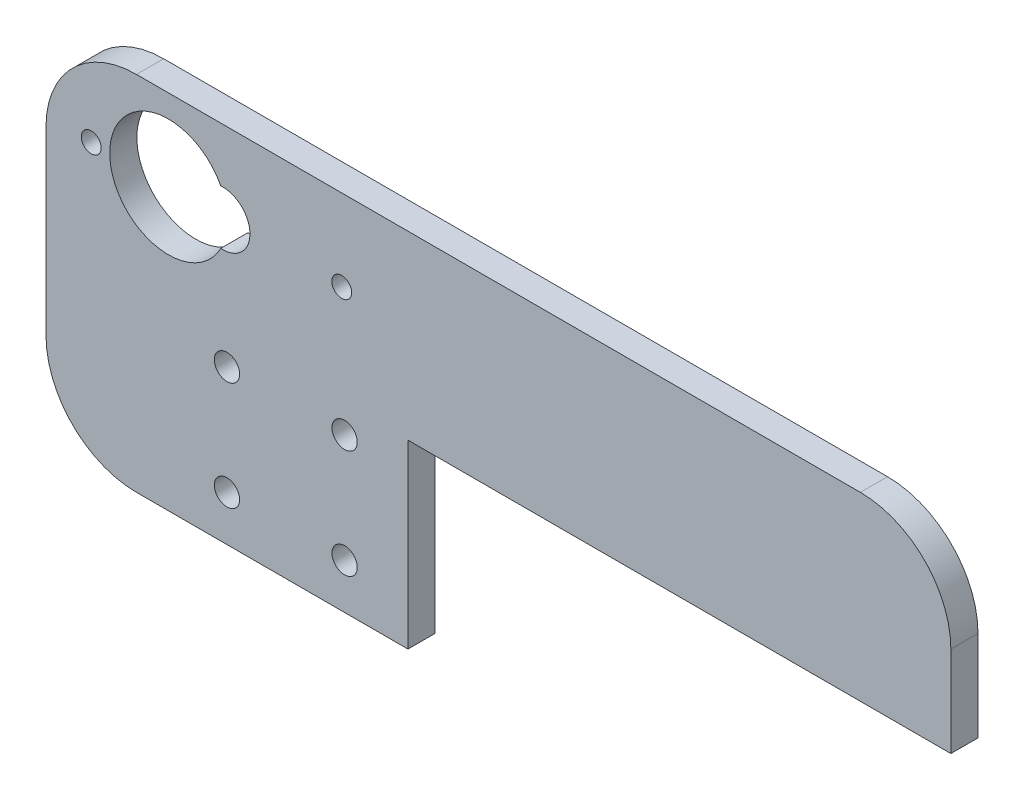
ISO-10303-21;
HEADER;
FILE_DESCRIPTION(('STEP AP214'),'2;1');
FILE_NAME('part.step','',(''),(''),'','','');
FILE_SCHEMA(('AUTOMOTIVE_DESIGN { 1 0 10303 214 1 1 1 1 }'));
ENDSEC;
DATA;
#1=APPLICATION_CONTEXT('core data for automotive mechanical design processes');
#2=APPLICATION_PROTOCOL_DEFINITION('international standard','automotive_design',2000,#1);
#3=PRODUCT_CONTEXT('',#1,'mechanical');
#4=PRODUCT('Part','Part','',(#3));
#5=PRODUCT_RELATED_PRODUCT_CATEGORY('part','',(#4));
#6=PRODUCT_DEFINITION_FORMATION('','',#4);
#7=PRODUCT_DEFINITION_CONTEXT('part definition',#1,'design');
#8=PRODUCT_DEFINITION('design','',#6,#7);
#9=PRODUCT_DEFINITION_SHAPE('','',#8);
#10=(LENGTH_UNIT() NAMED_UNIT(*) SI_UNIT(.MILLI.,.METRE.));
#11=(NAMED_UNIT(*) PLANE_ANGLE_UNIT() SI_UNIT($,.RADIAN.));
#12=(NAMED_UNIT(*) SI_UNIT($,.STERADIAN.) SOLID_ANGLE_UNIT());
#13=UNCERTAINTY_MEASURE_WITH_UNIT(LENGTH_MEASURE(1.E-05),#10,'distance_accuracy_value','');
#14=(GEOMETRIC_REPRESENTATION_CONTEXT(3) GLOBAL_UNCERTAINTY_ASSIGNED_CONTEXT((#13)) GLOBAL_UNIT_ASSIGNED_CONTEXT((#10,
#11,#12)) REPRESENTATION_CONTEXT('',''));
#15=CARTESIAN_POINT('',(0.,0.,0.));
#16=DIRECTION('',(0.,0.,1.));
#17=DIRECTION('',(1.,0.,0.));
#18=AXIS2_PLACEMENT_3D('',#15,#16,#17);
#19=CARTESIAN_POINT('',(0.,0.,3.));
#20=DIRECTION('',(1.,0.,0.));
#21=DIRECTION('',(0.,0.,-1.));
#22=AXIS2_PLACEMENT_3D('',#19,#20,#21);
#23=PLANE('',#22);
#24=DIRECTION('',(0.,-1.,0.));
#25=VECTOR('',#24,1.);
#26=CARTESIAN_POINT('',(0.,0.,0.));
#27=LINE('',#26,#25);
#28=CARTESIAN_POINT('',(0.,30.,0.));
#29=VERTEX_POINT('',#28);
#30=CARTESIAN_POINT('',(0.,10.,0.));
#31=VERTEX_POINT('',#30);
#32=EDGE_CURVE('E193',#29,#31,#27,.T.);
#33=ORIENTED_EDGE('',*,*,#32,.T.);
#34=DIRECTION('',(0.,0.,-1.));
#35=VECTOR('',#34,1.);
#36=CARTESIAN_POINT('',(0.,10.,3.));
#37=LINE('',#36,#35);
#38=CARTESIAN_POINT('',(0.,10.,3.));
#39=VERTEX_POINT('',#38);
#40=EDGE_CURVE('E226',#31,#39,#37,.F.);
#41=ORIENTED_EDGE('',*,*,#40,.T.);
#42=DIRECTION('',(0.,-1.,0.));
#43=VECTOR('',#42,1.);
#44=CARTESIAN_POINT('',(0.,0.,3.));
#45=LINE('',#44,#43);
#46=CARTESIAN_POINT('',(0.,30.,3.));
#47=VERTEX_POINT('',#46);
#48=EDGE_CURVE('E196',#47,#39,#45,.T.);
#49=ORIENTED_EDGE('',*,*,#48,.F.);
#50=DIRECTION('',(0.,0.,-1.));
#51=VECTOR('',#50,1.);
#52=CARTESIAN_POINT('',(0.,30.,3.));
#53=LINE('',#52,#51);
#54=EDGE_CURVE('E223',#47,#29,#53,.T.);
#55=ORIENTED_EDGE('',*,*,#54,.T.);
#56=EDGE_LOOP('',(#33,#41,#49,#55));
#57=FACE_BOUND('',#56,.T.);
#58=ADVANCED_FACE('F39',(#57),#23,.F.);
#59=CARTESIAN_POINT('',(0.,0.,3.));
#60=DIRECTION('',(0.,1.,0.));
#61=DIRECTION('',(0.,0.,1.));
#62=AXIS2_PLACEMENT_3D('',#59,#60,#61);
#63=PLANE('',#62);
#64=DIRECTION('',(1.,0.,0.));
#65=VECTOR('',#64,1.);
#66=CARTESIAN_POINT('',(0.,0.,3.));
#67=LINE('',#66,#65);
#68=CARTESIAN_POINT('',(10.,0.,3.));
#69=VERTEX_POINT('',#68);
#70=CARTESIAN_POINT('',(40.,0.,3.));
#71=VERTEX_POINT('',#70);
#72=EDGE_CURVE('E199',#69,#71,#67,.T.);
#73=ORIENTED_EDGE('',*,*,#72,.F.);
#74=DIRECTION('',(0.,0.,-1.));
#75=VECTOR('',#74,1.);
#76=CARTESIAN_POINT('',(10.,0.,3.));
#77=LINE('',#76,#75);
#78=CARTESIAN_POINT('',(10.,0.,0.));
#79=VERTEX_POINT('',#78);
#80=EDGE_CURVE('E206',#69,#79,#77,.T.);
#81=ORIENTED_EDGE('',*,*,#80,.T.);
#82=DIRECTION('',(1.,0.,0.));
#83=VECTOR('',#82,1.);
#84=CARTESIAN_POINT('',(0.,0.,0.));
#85=LINE('',#84,#83);
#86=CARTESIAN_POINT('',(40.,0.,0.));
#87=VERTEX_POINT('',#86);
#88=EDGE_CURVE('E209',#79,#87,#85,.T.);
#89=ORIENTED_EDGE('',*,*,#88,.T.);
#90=DIRECTION('',(0.,0.,1.));
#91=VECTOR('',#90,1.);
#92=CARTESIAN_POINT('',(40.,0.,0.));
#93=LINE('',#92,#91);
#94=EDGE_CURVE('E165',#87,#71,#93,.T.);
#95=ORIENTED_EDGE('',*,*,#94,.T.);
#96=EDGE_LOOP('',(#73,#81,#89,#95));
#97=FACE_BOUND('',#96,.T.);
#98=ADVANCED_FACE('F255',(#97),#63,.F.);
#99=CARTESIAN_POINT('',(100.,0.,3.));
#100=DIRECTION('',(-1.,0.,0.));
#101=DIRECTION('',(0.,0.,1.));
#102=AXIS2_PLACEMENT_3D('',#99,#100,#101);
#103=PLANE('',#102);
#104=DIRECTION('',(0.,1.,0.));
#105=VECTOR('',#104,1.);
#106=CARTESIAN_POINT('',(100.,0.,0.));
#107=LINE('',#106,#105);
#108=CARTESIAN_POINT('',(100.,20.,0.));
#109=VERTEX_POINT('',#108);
#110=CARTESIAN_POINT('',(100.,30.,0.));
#111=VERTEX_POINT('',#110);
#112=EDGE_CURVE('E211',#109,#111,#107,.T.);
#113=ORIENTED_EDGE('',*,*,#112,.T.);
#114=DIRECTION('',(0.,0.,-1.));
#115=VECTOR('',#114,1.);
#116=CARTESIAN_POINT('',(100.,30.,3.));
#117=LINE('',#116,#115);
#118=CARTESIAN_POINT('',(100.,30.,3.));
#119=VERTEX_POINT('',#118);
#120=EDGE_CURVE('E11',#111,#119,#117,.F.);
#121=ORIENTED_EDGE('',*,*,#120,.T.);
#122=DIRECTION('',(0.,1.,0.));
#123=VECTOR('',#122,1.);
#124=CARTESIAN_POINT('',(100.,0.,3.));
#125=LINE('',#124,#123);
#126=CARTESIAN_POINT('',(100.,20.,3.));
#127=VERTEX_POINT('',#126);
#128=EDGE_CURVE('E202',#127,#119,#125,.T.);
#129=ORIENTED_EDGE('',*,*,#128,.F.);
#130=DIRECTION('',(0.,0.,1.));
#131=VECTOR('',#130,1.);
#132=CARTESIAN_POINT('',(100.,20.,0.));
#133=LINE('',#132,#131);
#134=EDGE_CURVE('E160',#109,#127,#133,.T.);
#135=ORIENTED_EDGE('',*,*,#134,.F.);
#136=EDGE_LOOP('',(#113,#121,#129,#135));
#137=FACE_BOUND('',#136,.T.);
#138=ADVANCED_FACE('F267',(#137),#103,.F.);
#139=CARTESIAN_POINT('',(0.,40.,3.));
#140=DIRECTION('',(0.,-1.,0.));
#141=DIRECTION('',(0.,0.,-1.));
#142=AXIS2_PLACEMENT_3D('',#139,#140,#141);
#143=PLANE('',#142);
#144=DIRECTION('',(-1.,0.,0.));
#145=VECTOR('',#144,1.);
#146=CARTESIAN_POINT('',(0.,40.,3.));
#147=LINE('',#146,#145);
#148=CARTESIAN_POINT('',(90.,40.,3.));
#149=VERTEX_POINT('',#148);
#150=CARTESIAN_POINT('',(10.,40.,3.));
#151=VERTEX_POINT('',#150);
#152=EDGE_CURVE('E204',#149,#151,#147,.T.);
#153=ORIENTED_EDGE('',*,*,#152,.F.);
#154=DIRECTION('',(0.,0.,-1.));
#155=VECTOR('',#154,1.);
#156=CARTESIAN_POINT('',(90.,40.,3.));
#157=LINE('',#156,#155);
#158=CARTESIAN_POINT('',(90.,40.,0.));
#159=VERTEX_POINT('',#158);
#160=EDGE_CURVE('E47',#149,#159,#157,.T.);
#161=ORIENTED_EDGE('',*,*,#160,.T.);
#162=DIRECTION('',(-1.,0.,0.));
#163=VECTOR('',#162,1.);
#164=CARTESIAN_POINT('',(0.,40.,0.));
#165=LINE('',#164,#163);
#166=CARTESIAN_POINT('',(10.,40.,0.));
#167=VERTEX_POINT('',#166);
#168=EDGE_CURVE('E200',#159,#167,#165,.T.);
#169=ORIENTED_EDGE('',*,*,#168,.T.);
#170=DIRECTION('',(0.,0.,-1.));
#171=VECTOR('',#170,1.);
#172=CARTESIAN_POINT('',(10.,40.,3.));
#173=LINE('',#172,#171);
#174=EDGE_CURVE('E54',#167,#151,#173,.F.);
#175=ORIENTED_EDGE('',*,*,#174,.T.);
#176=EDGE_LOOP('',(#153,#161,#169,#175));
#177=FACE_BOUND('',#176,.T.);
#178=ADVANCED_FACE('F236',(#177),#143,.F.);
#179=CARTESIAN_POINT('',(0.,0.,3.));
#180=DIRECTION('',(0.,0.,-1.));
#181=DIRECTION('',(-1.,0.,0.));
#182=AXIS2_PLACEMENT_3D('',#179,#180,#181);
#183=PLANE('',#182);
#184=CARTESIAN_POINT('',(32.68,31.,3.));
#185=DIRECTION('',(0.,0.,1.));
#186=DIRECTION('',(1.,0.,0.));
#187=AXIS2_PLACEMENT_3D('',#184,#185,#186);
#188=CIRCLE('',#187,1.1);
#189=CARTESIAN_POINT('',(33.78,31.,3.));
#190=VERTEX_POINT('',#189);
#191=EDGE_CURVE('E334',#190,#190,#188,.T.);
#192=ORIENTED_EDGE('',*,*,#191,.F.);
#193=EDGE_LOOP('',(#192));
#194=FACE_BOUND('',#193,.T.);
#195=CARTESIAN_POINT('',(5.,31.,3.));
#196=DIRECTION('',(0.,0.,1.));
#197=DIRECTION('',(1.,0.,0.));
#198=AXIS2_PLACEMENT_3D('',#195,#196,#197);
#199=CIRCLE('',#198,1.1);
#200=CARTESIAN_POINT('',(6.1,31.,3.));
#201=VERTEX_POINT('',#200);
#202=EDGE_CURVE('E149',#201,#201,#199,.T.);
#203=ORIENTED_EDGE('',*,*,#202,.F.);
#204=EDGE_LOOP('',(#203));
#205=FACE_BOUND('',#204,.T.);
#206=CARTESIAN_POINT('',(19.54,31.,3.));
#207=DIRECTION('',(0.,0.,1.));
#208=DIRECTION('',(1.,0.,0.));
#209=AXIS2_PLACEMENT_3D('',#206,#207,#208);
#210=CIRCLE('',#209,3.);
#211=CARTESIAN_POINT('',(19.3108333333333,28.0087656997672,3.));
#212=VERTEX_POINT('',#211);
#213=CARTESIAN_POINT('',(19.3108333333333,33.9912343002327,3.));
#214=VERTEX_POINT('',#213);
#215=EDGE_CURVE('E142',#212,#214,#210,.T.);
#216=ORIENTED_EDGE('',*,*,#215,.F.);
#217=CARTESIAN_POINT('',(13.54,31.,3.));
#218=DIRECTION('',(0.,0.,1.));
#219=DIRECTION('',(1.,0.,0.));
#220=AXIS2_PLACEMENT_3D('',#217,#218,#219);
#221=CIRCLE('',#220,6.50000000000001);
#222=EDGE_CURVE('E129',#214,#212,#221,.T.);
#223=ORIENTED_EDGE('',*,*,#222,.F.);
#224=EDGE_LOOP('',(#216,#223));
#225=FACE_BOUND('',#224,.T.);
#226=CARTESIAN_POINT('',(33.,5.,3.));
#227=DIRECTION('',(0.,0.,-1.));
#228=DIRECTION('',(-1.,0.,0.));
#229=AXIS2_PLACEMENT_3D('',#226,#227,#228);
#230=CIRCLE('',#229,1.4);
#231=CARTESIAN_POINT('',(31.6,5.,3.));
#232=VERTEX_POINT('',#231);
#233=EDGE_CURVE('E168',#232,#232,#230,.T.);
#234=ORIENTED_EDGE('',*,*,#233,.T.);
#235=EDGE_LOOP('',(#234));
#236=FACE_BOUND('',#235,.T.);
#237=CARTESIAN_POINT('',(33.,17.,3.));
#238=DIRECTION('',(0.,0.,-1.));
#239=DIRECTION('',(-1.,0.,0.));
#240=AXIS2_PLACEMENT_3D('',#237,#238,#239);
#241=CIRCLE('',#240,1.4);
#242=CARTESIAN_POINT('',(31.6,17.,3.));
#243=VERTEX_POINT('',#242);
#244=EDGE_CURVE('E182',#243,#243,#241,.T.);
#245=ORIENTED_EDGE('',*,*,#244,.T.);
#246=EDGE_LOOP('',(#245));
#247=FACE_BOUND('',#246,.T.);
#248=CARTESIAN_POINT('',(20.,17.,3.));
#249=DIRECTION('',(0.,0.,-1.));
#250=DIRECTION('',(-1.,0.,0.));
#251=AXIS2_PLACEMENT_3D('',#248,#249,#250);
#252=CIRCLE('',#251,1.4);
#253=CARTESIAN_POINT('',(18.6,17.,3.));
#254=VERTEX_POINT('',#253);
#255=EDGE_CURVE('E176',#254,#254,#252,.T.);
#256=ORIENTED_EDGE('',*,*,#255,.T.);
#257=EDGE_LOOP('',(#256));
#258=FACE_BOUND('',#257,.T.);
#259=CARTESIAN_POINT('',(20.,5.,3.));
#260=DIRECTION('',(0.,0.,-1.));
#261=DIRECTION('',(-1.,0.,0.));
#262=AXIS2_PLACEMENT_3D('',#259,#260,#261);
#263=CIRCLE('',#262,1.4);
#264=CARTESIAN_POINT('',(18.6,5.,3.));
#265=VERTEX_POINT('',#264);
#266=EDGE_CURVE('E190',#265,#265,#263,.T.);
#267=ORIENTED_EDGE('',*,*,#266,.T.);
#268=EDGE_LOOP('',(#267));
#269=FACE_BOUND('',#268,.T.);
#270=ORIENTED_EDGE('',*,*,#48,.T.);
#271=CARTESIAN_POINT('',(10.,10.,3.));
#272=DIRECTION('',(0.,0.,-1.));
#273=DIRECTION('',(-1.,0.,0.));
#274=AXIS2_PLACEMENT_3D('',#271,#272,#273);
#275=CIRCLE('',#274,10.);
#276=EDGE_CURVE('E231',#39,#69,#275,.F.);
#277=ORIENTED_EDGE('',*,*,#276,.T.);
#278=ORIENTED_EDGE('',*,*,#72,.T.);
#279=DIRECTION('',(0.,-1.,0.));
#280=VECTOR('',#279,1.);
#281=CARTESIAN_POINT('',(40.,0.,3.));
#282=LINE('',#281,#280);
#283=CARTESIAN_POINT('',(40.,20.,3.));
#284=VERTEX_POINT('',#283);
#285=EDGE_CURVE('E157',#284,#71,#282,.T.);
#286=ORIENTED_EDGE('',*,*,#285,.F.);
#287=DIRECTION('',(-1.,0.,0.));
#288=VECTOR('',#287,1.);
#289=CARTESIAN_POINT('',(100.,20.,3.));
#290=LINE('',#289,#288);
#291=EDGE_CURVE('E151',#127,#284,#290,.T.);
#292=ORIENTED_EDGE('',*,*,#291,.F.);
#293=ORIENTED_EDGE('',*,*,#128,.T.);
#294=CARTESIAN_POINT('',(90.,30.,3.));
#295=DIRECTION('',(0.,0.,-1.));
#296=DIRECTION('',(-1.,0.,0.));
#297=AXIS2_PLACEMENT_3D('',#294,#295,#296);
#298=CIRCLE('',#297,10.);
#299=EDGE_CURVE('E61',#119,#149,#298,.F.);
#300=ORIENTED_EDGE('',*,*,#299,.T.);
#301=ORIENTED_EDGE('',*,*,#152,.T.);
#302=CARTESIAN_POINT('',(10.,30.,3.));
#303=DIRECTION('',(0.,0.,-1.));
#304=DIRECTION('',(-1.,0.,0.));
#305=AXIS2_PLACEMENT_3D('',#302,#303,#304);
#306=CIRCLE('',#305,10.);
#307=EDGE_CURVE('E228',#151,#47,#306,.F.);
#308=ORIENTED_EDGE('',*,*,#307,.T.);
#309=EDGE_LOOP('',(#270,#277,#278,#286,#292,#293,#300,#301,#308));
#310=FACE_BOUND('',#309,.T.);
#311=ADVANCED_FACE('F249',(#194,#205,#225,#236,#247,#258,#269,#310),#183,.F.);
#312=CARTESIAN_POINT('',(0.,0.,0.));
#313=DIRECTION('',(0.,0.,-1.));
#314=DIRECTION('',(-1.,0.,0.));
#315=AXIS2_PLACEMENT_3D('',#312,#313,#314);
#316=PLANE('',#315);
#317=CARTESIAN_POINT('',(32.68,31.,0.));
#318=DIRECTION('',(0.,0.,1.));
#319=DIRECTION('',(1.,0.,0.));
#320=AXIS2_PLACEMENT_3D('',#317,#318,#319);
#321=CIRCLE('',#320,1.1);
#322=CARTESIAN_POINT('',(33.78,31.,0.));
#323=VERTEX_POINT('',#322);
#324=EDGE_CURVE('E146',#323,#323,#321,.T.);
#325=ORIENTED_EDGE('',*,*,#324,.T.);
#326=EDGE_LOOP('',(#325));
#327=FACE_BOUND('',#326,.T.);
#328=CARTESIAN_POINT('',(5.,31.,0.));
#329=DIRECTION('',(0.,0.,1.));
#330=DIRECTION('',(1.,0.,0.));
#331=AXIS2_PLACEMENT_3D('',#328,#329,#330);
#332=CIRCLE('',#331,1.1);
#333=CARTESIAN_POINT('',(6.1,31.,0.));
#334=VERTEX_POINT('',#333);
#335=EDGE_CURVE('E329',#334,#334,#332,.T.);
#336=ORIENTED_EDGE('',*,*,#335,.T.);
#337=EDGE_LOOP('',(#336));
#338=FACE_BOUND('',#337,.T.);
#339=CARTESIAN_POINT('',(13.54,31.,0.));
#340=DIRECTION('',(0.,0.,1.));
#341=DIRECTION('',(1.,0.,0.));
#342=AXIS2_PLACEMENT_3D('',#339,#340,#341);
#343=CIRCLE('',#342,6.50000000000001);
#344=CARTESIAN_POINT('',(19.3108333333333,33.9912343002327,0.));
#345=VERTEX_POINT('',#344);
#346=CARTESIAN_POINT('',(19.3108333333333,28.0087656997672,0.));
#347=VERTEX_POINT('',#346);
#348=EDGE_CURVE('E126',#345,#347,#343,.T.);
#349=ORIENTED_EDGE('',*,*,#348,.T.);
#350=CARTESIAN_POINT('',(19.54,31.,0.));
#351=DIRECTION('',(0.,0.,1.));
#352=DIRECTION('',(1.,0.,0.));
#353=AXIS2_PLACEMENT_3D('',#350,#351,#352);
#354=CIRCLE('',#353,3.);
#355=EDGE_CURVE('E134',#347,#345,#354,.T.);
#356=ORIENTED_EDGE('',*,*,#355,.T.);
#357=EDGE_LOOP('',(#349,#356));
#358=FACE_BOUND('',#357,.T.);
#359=ORIENTED_EDGE('',*,*,#88,.F.);
#360=CARTESIAN_POINT('',(10.,10.,0.));
#361=DIRECTION('',(0.,0.,-1.));
#362=DIRECTION('',(-1.,0.,0.));
#363=AXIS2_PLACEMENT_3D('',#360,#361,#362);
#364=CIRCLE('',#363,10.);
#365=EDGE_CURVE('E221',#79,#31,#364,.T.);
#366=ORIENTED_EDGE('',*,*,#365,.T.);
#367=ORIENTED_EDGE('',*,*,#32,.F.);
#368=CARTESIAN_POINT('',(10.,30.,0.));
#369=DIRECTION('',(0.,0.,-1.));
#370=DIRECTION('',(-1.,0.,0.));
#371=AXIS2_PLACEMENT_3D('',#368,#369,#370);
#372=CIRCLE('',#371,10.);
#373=EDGE_CURVE('E217',#29,#167,#372,.T.);
#374=ORIENTED_EDGE('',*,*,#373,.T.);
#375=ORIENTED_EDGE('',*,*,#168,.F.);
#376=CARTESIAN_POINT('',(90.,30.,0.));
#377=DIRECTION('',(0.,0.,-1.));
#378=DIRECTION('',(-1.,0.,0.));
#379=AXIS2_PLACEMENT_3D('',#376,#377,#378);
#380=CIRCLE('',#379,10.);
#381=EDGE_CURVE('E219',#159,#111,#380,.T.);
#382=ORIENTED_EDGE('',*,*,#381,.T.);
#383=ORIENTED_EDGE('',*,*,#112,.F.);
#384=DIRECTION('',(-1.,0.,0.));
#385=VECTOR('',#384,1.);
#386=CARTESIAN_POINT('',(100.,20.,0.));
#387=LINE('',#386,#385);
#388=CARTESIAN_POINT('',(40.,20.,0.));
#389=VERTEX_POINT('',#388);
#390=EDGE_CURVE('E153',#109,#389,#387,.T.);
#391=ORIENTED_EDGE('',*,*,#390,.T.);
#392=DIRECTION('',(0.,-1.,0.));
#393=VECTOR('',#392,1.);
#394=CARTESIAN_POINT('',(40.,0.,0.));
#395=LINE('',#394,#393);
#396=EDGE_CURVE('E156',#389,#87,#395,.T.);
#397=ORIENTED_EDGE('',*,*,#396,.T.);
#398=EDGE_LOOP('',(#359,#366,#367,#374,#375,#382,#383,#391,#397));
#399=FACE_BOUND('',#398,.T.);
#400=CARTESIAN_POINT('',(33.,5.,0.));
#401=DIRECTION('',(0.,0.,-1.));
#402=DIRECTION('',(-1.,0.,0.));
#403=AXIS2_PLACEMENT_3D('',#400,#401,#402);
#404=CIRCLE('',#403,1.4);
#405=CARTESIAN_POINT('',(31.6,5.,0.));
#406=VERTEX_POINT('',#405);
#407=EDGE_CURVE('E185',#406,#406,#404,.T.);
#408=ORIENTED_EDGE('',*,*,#407,.F.);
#409=EDGE_LOOP('',(#408));
#410=FACE_BOUND('',#409,.T.);
#411=CARTESIAN_POINT('',(33.,17.,0.));
#412=DIRECTION('',(0.,0.,-1.));
#413=DIRECTION('',(-1.,0.,0.));
#414=AXIS2_PLACEMENT_3D('',#411,#412,#413);
#415=CIRCLE('',#414,1.4);
#416=CARTESIAN_POINT('',(31.6,17.,0.));
#417=VERTEX_POINT('',#416);
#418=EDGE_CURVE('E179',#417,#417,#415,.T.);
#419=ORIENTED_EDGE('',*,*,#418,.F.);
#420=EDGE_LOOP('',(#419));
#421=FACE_BOUND('',#420,.T.);
#422=CARTESIAN_POINT('',(20.,17.,0.));
#423=DIRECTION('',(0.,0.,-1.));
#424=DIRECTION('',(-1.,0.,0.));
#425=AXIS2_PLACEMENT_3D('',#422,#423,#424);
#426=CIRCLE('',#425,1.4);
#427=CARTESIAN_POINT('',(18.6,17.,0.));
#428=VERTEX_POINT('',#427);
#429=EDGE_CURVE('E172',#428,#428,#426,.T.);
#430=ORIENTED_EDGE('',*,*,#429,.F.);
#431=EDGE_LOOP('',(#430));
#432=FACE_BOUND('',#431,.T.);
#433=CARTESIAN_POINT('',(20.,5.,0.));
#434=DIRECTION('',(0.,0.,-1.));
#435=DIRECTION('',(-1.,0.,0.));
#436=AXIS2_PLACEMENT_3D('',#433,#434,#435);
#437=CIRCLE('',#436,1.4);
#438=CARTESIAN_POINT('',(18.6,5.,0.));
#439=VERTEX_POINT('',#438);
#440=EDGE_CURVE('E175',#439,#439,#437,.T.);
#441=ORIENTED_EDGE('',*,*,#440,.F.);
#442=EDGE_LOOP('',(#441));
#443=FACE_BOUND('',#442,.T.);
#444=ADVANCED_FACE('F140',(#327,#338,#358,#399,#410,#421,#432,#443),#316,.T.);
#445=CARTESIAN_POINT('',(20.,5.,3.));
#446=DIRECTION('',(0.,0.,-1.));
#447=DIRECTION('',(-1.,0.,0.));
#448=AXIS2_PLACEMENT_3D('',#445,#446,#447);
#449=CYLINDRICAL_SURFACE('',#448,1.4);
#450=ORIENTED_EDGE('',*,*,#266,.F.);
#451=EDGE_LOOP('',(#450));
#452=FACE_BOUND('',#451,.T.);
#453=ORIENTED_EDGE('',*,*,#440,.T.);
#454=EDGE_LOOP('',(#453));
#455=FACE_BOUND('',#454,.T.);
#456=ADVANCED_FACE('F291',(#452,#455),#449,.F.);
#457=CARTESIAN_POINT('',(20.,17.,3.));
#458=DIRECTION('',(0.,0.,-1.));
#459=DIRECTION('',(-1.,0.,0.));
#460=AXIS2_PLACEMENT_3D('',#457,#458,#459);
#461=CYLINDRICAL_SURFACE('',#460,1.4);
#462=ORIENTED_EDGE('',*,*,#255,.F.);
#463=EDGE_LOOP('',(#462));
#464=FACE_BOUND('',#463,.T.);
#465=ORIENTED_EDGE('',*,*,#429,.T.);
#466=EDGE_LOOP('',(#465));
#467=FACE_BOUND('',#466,.T.);
#468=ADVANCED_FACE('F298',(#464,#467),#461,.F.);
#469=CARTESIAN_POINT('',(33.,17.,3.));
#470=DIRECTION('',(0.,0.,-1.));
#471=DIRECTION('',(-1.,0.,0.));
#472=AXIS2_PLACEMENT_3D('',#469,#470,#471);
#473=CYLINDRICAL_SURFACE('',#472,1.4);
#474=ORIENTED_EDGE('',*,*,#244,.F.);
#475=EDGE_LOOP('',(#474));
#476=FACE_BOUND('',#475,.T.);
#477=ORIENTED_EDGE('',*,*,#418,.T.);
#478=EDGE_LOOP('',(#477));
#479=FACE_BOUND('',#478,.T.);
#480=ADVANCED_FACE('F303',(#476,#479),#473,.F.);
#481=CARTESIAN_POINT('',(33.,5.,3.));
#482=DIRECTION('',(0.,0.,-1.));
#483=DIRECTION('',(-1.,0.,0.));
#484=AXIS2_PLACEMENT_3D('',#481,#482,#483);
#485=CYLINDRICAL_SURFACE('',#484,1.4);
#486=ORIENTED_EDGE('',*,*,#233,.F.);
#487=EDGE_LOOP('',(#486));
#488=FACE_BOUND('',#487,.T.);
#489=ORIENTED_EDGE('',*,*,#407,.T.);
#490=EDGE_LOOP('',(#489));
#491=FACE_BOUND('',#490,.T.);
#492=ADVANCED_FACE('F300',(#488,#491),#485,.F.);
#493=CARTESIAN_POINT('',(40.,0.,0.));
#494=DIRECTION('',(-1.,0.,0.));
#495=DIRECTION('',(0.,0.,1.));
#496=AXIS2_PLACEMENT_3D('',#493,#494,#495);
#497=PLANE('',#496);
#498=ORIENTED_EDGE('',*,*,#285,.T.);
#499=ORIENTED_EDGE('',*,*,#94,.F.);
#500=ORIENTED_EDGE('',*,*,#396,.F.);
#501=DIRECTION('',(0.,0.,1.));
#502=VECTOR('',#501,1.);
#503=CARTESIAN_POINT('',(40.,20.,0.));
#504=LINE('',#503,#502);
#505=EDGE_CURVE('E169',#389,#284,#504,.T.);
#506=ORIENTED_EDGE('',*,*,#505,.T.);
#507=EDGE_LOOP('',(#498,#499,#500,#506));
#508=FACE_BOUND('',#507,.T.);
#509=ADVANCED_FACE('F259',(#508),#497,.F.);
#510=CARTESIAN_POINT('',(100.,20.,0.));
#511=DIRECTION('',(0.,1.,0.));
#512=DIRECTION('',(-1.,0.,0.));
#513=AXIS2_PLACEMENT_3D('',#510,#511,#512);
#514=PLANE('',#513);
#515=ORIENTED_EDGE('',*,*,#291,.T.);
#516=ORIENTED_EDGE('',*,*,#505,.F.);
#517=ORIENTED_EDGE('',*,*,#390,.F.);
#518=ORIENTED_EDGE('',*,*,#134,.T.);
#519=EDGE_LOOP('',(#515,#516,#517,#518));
#520=FACE_BOUND('',#519,.T.);
#521=ADVANCED_FACE('F261',(#520),#514,.F.);
#522=CARTESIAN_POINT('',(13.54,31.,0.));
#523=DIRECTION('',(0.,0.,1.));
#524=DIRECTION('',(1.,0.,0.));
#525=AXIS2_PLACEMENT_3D('',#522,#523,#524);
#526=CYLINDRICAL_SURFACE('',#525,6.50000000000001);
#527=ORIENTED_EDGE('',*,*,#222,.T.);
#528=DIRECTION('',(0.,0.,1.));
#529=VECTOR('',#528,1.);
#530=CARTESIAN_POINT('',(19.3108333333333,28.0087656997672,0.));
#531=LINE('',#530,#529);
#532=EDGE_CURVE('E122',#347,#212,#531,.T.);
#533=ORIENTED_EDGE('',*,*,#532,.F.);
#534=ORIENTED_EDGE('',*,*,#348,.F.);
#535=DIRECTION('',(0.,0.,1.));
#536=VECTOR('',#535,1.);
#537=CARTESIAN_POINT('',(19.3108333333333,33.9912343002327,0.));
#538=LINE('',#537,#536);
#539=EDGE_CURVE('E133',#345,#214,#538,.T.);
#540=ORIENTED_EDGE('',*,*,#539,.T.);
#541=EDGE_LOOP('',(#527,#533,#534,#540));
#542=FACE_BOUND('',#541,.T.);
#543=ADVANCED_FACE('F124',(#542),#526,.F.);
#544=CARTESIAN_POINT('',(19.54,31.,0.));
#545=DIRECTION('',(0.,0.,1.));
#546=DIRECTION('',(1.,0.,0.));
#547=AXIS2_PLACEMENT_3D('',#544,#545,#546);
#548=CYLINDRICAL_SURFACE('',#547,3.);
#549=ORIENTED_EDGE('',*,*,#215,.T.);
#550=ORIENTED_EDGE('',*,*,#539,.F.);
#551=ORIENTED_EDGE('',*,*,#355,.F.);
#552=ORIENTED_EDGE('',*,*,#532,.T.);
#553=EDGE_LOOP('',(#549,#550,#551,#552));
#554=FACE_BOUND('',#553,.T.);
#555=ADVANCED_FACE('F137',(#554),#548,.F.);
#556=CARTESIAN_POINT('',(5.,31.,0.));
#557=DIRECTION('',(0.,0.,1.));
#558=DIRECTION('',(1.,0.,0.));
#559=AXIS2_PLACEMENT_3D('',#556,#557,#558);
#560=CYLINDRICAL_SURFACE('',#559,1.1);
#561=ORIENTED_EDGE('',*,*,#335,.F.);
#562=EDGE_LOOP('',(#561));
#563=FACE_BOUND('',#562,.T.);
#564=ORIENTED_EDGE('',*,*,#202,.T.);
#565=EDGE_LOOP('',(#564));
#566=FACE_BOUND('',#565,.T.);
#567=ADVANCED_FACE('F319',(#563,#566),#560,.F.);
#568=CARTESIAN_POINT('',(32.68,31.,0.));
#569=DIRECTION('',(0.,0.,1.));
#570=DIRECTION('',(1.,0.,0.));
#571=AXIS2_PLACEMENT_3D('',#568,#569,#570);
#572=CYLINDRICAL_SURFACE('',#571,1.1);
#573=ORIENTED_EDGE('',*,*,#324,.F.);
#574=EDGE_LOOP('',(#573));
#575=FACE_BOUND('',#574,.T.);
#576=ORIENTED_EDGE('',*,*,#191,.T.);
#577=EDGE_LOOP('',(#576));
#578=FACE_BOUND('',#577,.T.);
#579=ADVANCED_FACE('F275',(#575,#578),#572,.F.);
#580=CARTESIAN_POINT('',(10.,10.,3.));
#581=DIRECTION('',(0.,0.,-1.));
#582=DIRECTION('',(-1.,0.,0.));
#583=AXIS2_PLACEMENT_3D('',#580,#581,#582);
#584=CYLINDRICAL_SURFACE('',#583,10.);
#585=ORIENTED_EDGE('',*,*,#276,.F.);
#586=ORIENTED_EDGE('',*,*,#40,.F.);
#587=ORIENTED_EDGE('',*,*,#365,.F.);
#588=ORIENTED_EDGE('',*,*,#80,.F.);
#589=EDGE_LOOP('',(#585,#586,#587,#588));
#590=FACE_BOUND('',#589,.T.);
#591=ADVANCED_FACE('F253',(#590),#584,.T.);
#592=CARTESIAN_POINT('',(90.,30.,3.));
#593=DIRECTION('',(0.,0.,-1.));
#594=DIRECTION('',(-1.,0.,0.));
#595=AXIS2_PLACEMENT_3D('',#592,#593,#594);
#596=CYLINDRICAL_SURFACE('',#595,10.);
#597=ORIENTED_EDGE('',*,*,#299,.F.);
#598=ORIENTED_EDGE('',*,*,#120,.F.);
#599=ORIENTED_EDGE('',*,*,#381,.F.);
#600=ORIENTED_EDGE('',*,*,#160,.F.);
#601=EDGE_LOOP('',(#597,#598,#599,#600));
#602=FACE_BOUND('',#601,.T.);
#603=ADVANCED_FACE('F269',(#602),#596,.T.);
#604=CARTESIAN_POINT('',(10.,30.,3.));
#605=DIRECTION('',(0.,0.,-1.));
#606=DIRECTION('',(-1.,0.,0.));
#607=AXIS2_PLACEMENT_3D('',#604,#605,#606);
#608=CYLINDRICAL_SURFACE('',#607,10.);
#609=ORIENTED_EDGE('',*,*,#307,.F.);
#610=ORIENTED_EDGE('',*,*,#174,.F.);
#611=ORIENTED_EDGE('',*,*,#373,.F.);
#612=ORIENTED_EDGE('',*,*,#54,.F.);
#613=EDGE_LOOP('',(#609,#610,#611,#612));
#614=FACE_BOUND('',#613,.T.);
#615=ADVANCED_FACE('F41',(#614),#608,.T.);
#616=CLOSED_SHELL('',(#58,#98,#138,#178,#311,#444,#456,#468,#480,#492,#509,#521,#543,#555,#567,
#579,#591,#603,#615));
#617=MANIFOLD_SOLID_BREP('B2',#616);
#618=ADVANCED_BREP_SHAPE_REPRESENTATION('',(#18,#617),#14);
#619=SHAPE_DEFINITION_REPRESENTATION(#9,#618);
ENDSEC;
END-ISO-10303-21;
